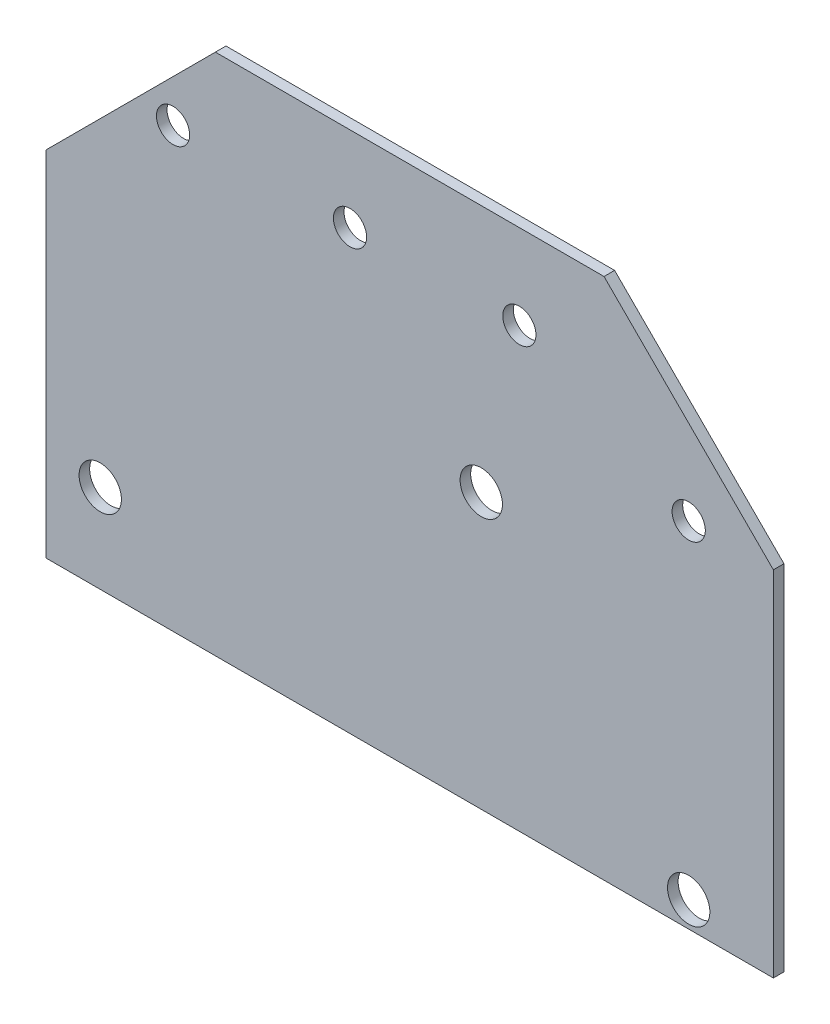
ISO-10303-21;
HEADER;
FILE_DESCRIPTION(('STEP AP214'),'2;1');
FILE_NAME('part.step','',(''),(''),'','','');
FILE_SCHEMA(('AUTOMOTIVE_DESIGN { 1 0 10303 214 1 1 1 1 }'));
ENDSEC;
DATA;
#1=APPLICATION_CONTEXT('core data for automotive mechanical design processes');
#2=APPLICATION_PROTOCOL_DEFINITION('international standard','automotive_design',2000,#1);
#3=PRODUCT_CONTEXT('',#1,'mechanical');
#4=PRODUCT('Part','Part','',(#3));
#5=PRODUCT_RELATED_PRODUCT_CATEGORY('part','',(#4));
#6=PRODUCT_DEFINITION_FORMATION('','',#4);
#7=PRODUCT_DEFINITION_CONTEXT('part definition',#1,'design');
#8=PRODUCT_DEFINITION('design','',#6,#7);
#9=PRODUCT_DEFINITION_SHAPE('','',#8);
#10=(LENGTH_UNIT() NAMED_UNIT(*) SI_UNIT(.MILLI.,.METRE.));
#11=(NAMED_UNIT(*) PLANE_ANGLE_UNIT() SI_UNIT($,.RADIAN.));
#12=(NAMED_UNIT(*) SI_UNIT($,.STERADIAN.) SOLID_ANGLE_UNIT());
#13=UNCERTAINTY_MEASURE_WITH_UNIT(LENGTH_MEASURE(1.E-05),#10,'distance_accuracy_value','');
#14=(GEOMETRIC_REPRESENTATION_CONTEXT(3) GLOBAL_UNCERTAINTY_ASSIGNED_CONTEXT((#13)) GLOBAL_UNIT_ASSIGNED_CONTEXT((#10,
#11,#12)) REPRESENTATION_CONTEXT('',''));
#15=CARTESIAN_POINT('',(0.,0.,0.));
#16=DIRECTION('',(0.,0.,1.));
#17=DIRECTION('',(1.,0.,0.));
#18=AXIS2_PLACEMENT_3D('',#15,#16,#17);
#19=CARTESIAN_POINT('',(342.900001015996,-12.7,1.5875));
#20=DIRECTION('',(-0.707106781186548,-0.707106781186547,0.));
#21=DIRECTION('',(0.707106781186547,-0.707106781186548,0.));
#22=AXIS2_PLACEMENT_3D('',#19,#20,#21);
#23=PLANE('',#22);
#24=DIRECTION('',(-0.707106781186547,0.707106781186548,0.));
#25=VECTOR('',#24,1.);
#26=CARTESIAN_POINT('',(342.900001015996,-12.7,0.));
#27=LINE('',#26,#25);
#28=CARTESIAN_POINT('',(342.900001015996,-12.7,0.));
#29=VERTEX_POINT('',#28);
#30=CARTESIAN_POINT('',(317.500001015996,12.7,0.));
#31=VERTEX_POINT('',#30);
#32=EDGE_CURVE('E121',#29,#31,#27,.T.);
#33=ORIENTED_EDGE('',*,*,#32,.T.);
#34=DIRECTION('',(0.,0.,-1.));
#35=VECTOR('',#34,1.);
#36=CARTESIAN_POINT('',(317.500001015996,12.7,1.5875));
#37=LINE('',#36,#35);
#38=CARTESIAN_POINT('',(317.500001015996,12.7,1.5875));
#39=VERTEX_POINT('',#38);
#40=EDGE_CURVE('E11',#39,#31,#37,.T.);
#41=ORIENTED_EDGE('',*,*,#40,.F.);
#42=DIRECTION('',(-0.707106781186547,0.707106781186548,0.));
#43=VECTOR('',#42,1.);
#44=CARTESIAN_POINT('',(342.900001015996,-12.7,1.5875));
#45=LINE('',#44,#43);
#46=CARTESIAN_POINT('',(342.900001015996,-12.7,1.5875));
#47=VERTEX_POINT('',#46);
#48=EDGE_CURVE('E132',#47,#39,#45,.T.);
#49=ORIENTED_EDGE('',*,*,#48,.F.);
#50=DIRECTION('',(0.,0.,-1.));
#51=VECTOR('',#50,1.);
#52=CARTESIAN_POINT('',(342.900001015996,-12.7,1.5875));
#53=LINE('',#52,#51);
#54=EDGE_CURVE('E117',#47,#29,#53,.T.);
#55=ORIENTED_EDGE('',*,*,#54,.T.);
#56=EDGE_LOOP('',(#33,#41,#49,#55));
#57=FACE_BOUND('',#56,.T.);
#58=ADVANCED_FACE('F37',(#57),#23,.F.);
#59=CARTESIAN_POINT('',(317.500001015996,12.7,1.5875));
#60=DIRECTION('',(0.,-1.,0.));
#61=DIRECTION('',(0.,0.,-1.));
#62=AXIS2_PLACEMENT_3D('',#59,#60,#61);
#63=PLANE('',#62);
#64=DIRECTION('',(-1.,0.,0.));
#65=VECTOR('',#64,1.);
#66=CARTESIAN_POINT('',(317.500001015996,12.7,0.));
#67=LINE('',#66,#65);
#68=CARTESIAN_POINT('',(259.20700050648,12.7,0.));
#69=VERTEX_POINT('',#68);
#70=EDGE_CURVE('E124',#31,#69,#67,.T.);
#71=ORIENTED_EDGE('',*,*,#70,.T.);
#72=DIRECTION('',(0.,0.,-1.));
#73=VECTOR('',#72,1.);
#74=CARTESIAN_POINT('',(259.20700050648,12.7,1.5875));
#75=LINE('',#74,#73);
#76=CARTESIAN_POINT('',(259.20700050648,12.7,1.5875));
#77=VERTEX_POINT('',#76);
#78=EDGE_CURVE('E45',#77,#69,#75,.T.);
#79=ORIENTED_EDGE('',*,*,#78,.F.);
#80=DIRECTION('',(-1.,0.,0.));
#81=VECTOR('',#80,1.);
#82=CARTESIAN_POINT('',(317.500001015996,12.7,1.5875));
#83=LINE('',#82,#81);
#84=EDGE_CURVE('E90',#39,#77,#83,.T.);
#85=ORIENTED_EDGE('',*,*,#84,.F.);
#86=ORIENTED_EDGE('',*,*,#40,.T.);
#87=EDGE_LOOP('',(#71,#79,#85,#86));
#88=FACE_BOUND('',#87,.T.);
#89=ADVANCED_FACE('F157',(#88),#63,.F.);
#90=CARTESIAN_POINT('',(259.20700050648,12.7,1.5875));
#91=DIRECTION('',(0.707106781186548,-0.707106781186547,0.));
#92=DIRECTION('',(0.707106781186547,0.707106781186548,0.));
#93=AXIS2_PLACEMENT_3D('',#90,#91,#92);
#94=PLANE('',#93);
#95=DIRECTION('',(-0.707106781186547,-0.707106781186548,0.));
#96=VECTOR('',#95,1.);
#97=CARTESIAN_POINT('',(259.20700050648,12.7,0.));
#98=LINE('',#97,#96);
#99=CARTESIAN_POINT('',(233.80700050648,-12.7,0.));
#100=VERTEX_POINT('',#99);
#101=EDGE_CURVE('E127',#69,#100,#98,.T.);
#102=ORIENTED_EDGE('',*,*,#101,.T.);
#103=DIRECTION('',(0.,0.,-1.));
#104=VECTOR('',#103,1.);
#105=CARTESIAN_POINT('',(233.80700050648,-12.7,1.5875));
#106=LINE('',#105,#104);
#107=CARTESIAN_POINT('',(233.80700050648,-12.7,1.5875));
#108=VERTEX_POINT('',#107);
#109=EDGE_CURVE('E112',#108,#100,#106,.T.);
#110=ORIENTED_EDGE('',*,*,#109,.F.);
#111=DIRECTION('',(-0.707106781186547,-0.707106781186548,0.));
#112=VECTOR('',#111,1.);
#113=CARTESIAN_POINT('',(259.20700050648,12.7,1.5875));
#114=LINE('',#113,#112);
#115=EDGE_CURVE('E103',#77,#108,#114,.T.);
#116=ORIENTED_EDGE('',*,*,#115,.F.);
#117=ORIENTED_EDGE('',*,*,#78,.T.);
#118=EDGE_LOOP('',(#102,#110,#116,#117));
#119=FACE_BOUND('',#118,.T.);
#120=ADVANCED_FACE('F138',(#119),#94,.F.);
#121=CARTESIAN_POINT('',(233.80700050648,-12.7,1.5875));
#122=DIRECTION('',(1.,0.,0.));
#123=DIRECTION('',(0.,0.,-1.));
#124=AXIS2_PLACEMENT_3D('',#121,#122,#123);
#125=PLANE('',#124);
#126=DIRECTION('',(0.,-1.,0.));
#127=VECTOR('',#126,1.);
#128=CARTESIAN_POINT('',(233.80700050648,-12.7,0.));
#129=LINE('',#128,#127);
#130=CARTESIAN_POINT('',(233.80700050648,-65.7225000001326,0.));
#131=VERTEX_POINT('',#130);
#132=EDGE_CURVE('E111',#100,#131,#129,.T.);
#133=ORIENTED_EDGE('',*,*,#132,.T.);
#134=DIRECTION('',(0.,0.,-1.));
#135=VECTOR('',#134,1.);
#136=CARTESIAN_POINT('',(233.80700050648,-65.7225000001326,1.5875));
#137=LINE('',#136,#135);
#138=CARTESIAN_POINT('',(233.80700050648,-65.7225000001326,1.5875));
#139=VERTEX_POINT('',#138);
#140=EDGE_CURVE('E108',#139,#131,#137,.T.);
#141=ORIENTED_EDGE('',*,*,#140,.F.);
#142=DIRECTION('',(0.,-1.,0.));
#143=VECTOR('',#142,1.);
#144=CARTESIAN_POINT('',(233.80700050648,-12.7,1.5875));
#145=LINE('',#144,#143);
#146=EDGE_CURVE('E97',#108,#139,#145,.T.);
#147=ORIENTED_EDGE('',*,*,#146,.F.);
#148=ORIENTED_EDGE('',*,*,#109,.T.);
#149=EDGE_LOOP('',(#133,#141,#147,#148));
#150=FACE_BOUND('',#149,.T.);
#151=ADVANCED_FACE('F109',(#150),#125,.F.);
#152=CARTESIAN_POINT('',(233.80700050648,-65.7225000001326,1.5875));
#153=DIRECTION('',(0.,1.,0.));
#154=DIRECTION('',(0.,0.,1.));
#155=AXIS2_PLACEMENT_3D('',#152,#153,#154);
#156=PLANE('',#155);
#157=DIRECTION('',(1.,0.,0.));
#158=VECTOR('',#157,1.);
#159=CARTESIAN_POINT('',(233.80700050648,-65.7225000001326,0.));
#160=LINE('',#159,#158);
#161=CARTESIAN_POINT('',(342.900001015996,-65.7225000001326,0.));
#162=VERTEX_POINT('',#161);
#163=EDGE_CURVE('E76',#131,#162,#160,.T.);
#164=ORIENTED_EDGE('',*,*,#163,.T.);
#165=DIRECTION('',(0.,0.,-1.));
#166=VECTOR('',#165,1.);
#167=CARTESIAN_POINT('',(342.900001015996,-65.7225000001326,1.5875));
#168=LINE('',#167,#166);
#169=CARTESIAN_POINT('',(342.900001015996,-65.7225000001326,1.5875));
#170=VERTEX_POINT('',#169);
#171=EDGE_CURVE('E113',#170,#162,#168,.T.);
#172=ORIENTED_EDGE('',*,*,#171,.F.);
#173=DIRECTION('',(1.,0.,0.));
#174=VECTOR('',#173,1.);
#175=CARTESIAN_POINT('',(233.80700050648,-65.7225000001326,1.5875));
#176=LINE('',#175,#174);
#177=EDGE_CURVE('E101',#139,#170,#176,.T.);
#178=ORIENTED_EDGE('',*,*,#177,.F.);
#179=ORIENTED_EDGE('',*,*,#140,.T.);
#180=EDGE_LOOP('',(#164,#172,#178,#179));
#181=FACE_BOUND('',#180,.T.);
#182=ADVANCED_FACE('F115',(#181),#156,.F.);
#183=CARTESIAN_POINT('',(342.900001015996,-65.7225000001326,1.5875));
#184=DIRECTION('',(-1.,0.,0.));
#185=DIRECTION('',(0.,0.,1.));
#186=AXIS2_PLACEMENT_3D('',#183,#184,#185);
#187=PLANE('',#186);
#188=DIRECTION('',(0.,1.,0.));
#189=VECTOR('',#188,1.);
#190=CARTESIAN_POINT('',(342.900001015996,-65.7225000001326,0.));
#191=LINE('',#190,#189);
#192=EDGE_CURVE('E82',#162,#29,#191,.T.);
#193=ORIENTED_EDGE('',*,*,#192,.T.);
#194=ORIENTED_EDGE('',*,*,#54,.F.);
#195=DIRECTION('',(0.,1.,0.));
#196=VECTOR('',#195,1.);
#197=CARTESIAN_POINT('',(342.900001015996,-65.7225000001326,1.5875));
#198=LINE('',#197,#196);
#199=EDGE_CURVE('E53',#170,#47,#198,.T.);
#200=ORIENTED_EDGE('',*,*,#199,.F.);
#201=ORIENTED_EDGE('',*,*,#171,.T.);
#202=EDGE_LOOP('',(#193,#194,#200,#201));
#203=FACE_BOUND('',#202,.T.);
#204=ADVANCED_FACE('F145',(#203),#187,.F.);
#205=CARTESIAN_POINT('',(0.,0.,1.5875));
#206=DIRECTION('',(0.,0.,1.));
#207=DIRECTION('',(1.,0.,0.));
#208=AXIS2_PLACEMENT_3D('',#205,#206,#207);
#209=PLANE('',#208);
#210=CARTESIAN_POINT('',(299.08500101593,-24.5251884521311,1.5875));
#211=DIRECTION('',(0.,0.,1.));
#212=DIRECTION('',(1.,0.,0.));
#213=AXIS2_PLACEMENT_3D('',#210,#211,#212);
#214=CIRCLE('',#213,3.17499999999998);
#215=CARTESIAN_POINT('',(302.26000101593,-24.5251884521311,1.5875));
#216=VERTEX_POINT('',#215);
#217=EDGE_CURVE('E317',#216,#216,#214,.T.);
#218=ORIENTED_EDGE('',*,*,#217,.F.);
#219=EDGE_LOOP('',(#218));
#220=FACE_BOUND('',#219,.T.);
#221=CARTESIAN_POINT('',(241.935001015939,-52.4651884521511,1.5875));
#222=DIRECTION('',(0.,0.,1.));
#223=DIRECTION('',(1.,0.,0.));
#224=AXIS2_PLACEMENT_3D('',#221,#222,#223);
#225=CIRCLE('',#224,3.17499999999998);
#226=CARTESIAN_POINT('',(245.110001015939,-52.4651884521511,1.5875));
#227=VERTEX_POINT('',#226);
#228=EDGE_CURVE('E319',#227,#227,#225,.T.);
#229=ORIENTED_EDGE('',*,*,#228,.F.);
#230=EDGE_LOOP('',(#229));
#231=FACE_BOUND('',#230,.T.);
#232=CARTESIAN_POINT('',(330.200001015876,-61.9124999998628,1.5875));
#233=DIRECTION('',(0.,0.,-1.));
#234=DIRECTION('',(-1.,0.,0.));
#235=AXIS2_PLACEMENT_3D('',#232,#233,#234);
#236=CIRCLE('',#235,3.17499999999998);
#237=CARTESIAN_POINT('',(327.025001015876,-61.9124999998628,1.5875));
#238=VERTEX_POINT('',#237);
#239=EDGE_CURVE('E330',#238,#238,#236,.T.);
#240=ORIENTED_EDGE('',*,*,#239,.T.);
#241=EDGE_LOOP('',(#240));
#242=FACE_BOUND('',#241,.T.);
#243=CARTESIAN_POINT('',(330.199999492,-12.7,1.5875));
#244=DIRECTION('',(0.,0.,-1.));
#245=DIRECTION('',(-1.,0.,0.));
#246=AXIS2_PLACEMENT_3D('',#243,#244,#245);
#247=CIRCLE('',#246,2.48919999999997);
#248=CARTESIAN_POINT('',(327.710799492,-12.7,1.5875));
#249=VERTEX_POINT('',#248);
#250=EDGE_CURVE('E336',#249,#249,#247,.T.);
#251=ORIENTED_EDGE('',*,*,#250,.T.);
#252=EDGE_LOOP('',(#251));
#253=FACE_BOUND('',#252,.T.);
#254=CARTESIAN_POINT('',(304.799999492002,-1.73472347597681E-12,1.5875));
#255=DIRECTION('',(0.,0.,-1.));
#256=DIRECTION('',(-1.,0.,0.));
#257=AXIS2_PLACEMENT_3D('',#254,#255,#256);
#258=CIRCLE('',#257,2.48919999999997);
#259=CARTESIAN_POINT('',(302.310799492002,-1.73472347597681E-12,1.5875));
#260=VERTEX_POINT('',#259);
#261=EDGE_CURVE('E342',#260,#260,#258,.T.);
#262=ORIENTED_EDGE('',*,*,#261,.T.);
#263=EDGE_LOOP('',(#262));
#264=FACE_BOUND('',#263,.T.);
#265=CARTESIAN_POINT('',(279.399999492,0.,1.5875));
#266=DIRECTION('',(0.,0.,-1.));
#267=DIRECTION('',(-1.,0.,0.));
#268=AXIS2_PLACEMENT_3D('',#265,#266,#267);
#269=CIRCLE('',#268,2.48919999999997);
#270=CARTESIAN_POINT('',(276.910799492,0.,1.5875));
#271=VERTEX_POINT('',#270);
#272=EDGE_CURVE('E348',#271,#271,#269,.T.);
#273=ORIENTED_EDGE('',*,*,#272,.T.);
#274=EDGE_LOOP('',(#273));
#275=FACE_BOUND('',#274,.T.);
#276=CARTESIAN_POINT('',(252.857001003831,-7.59112217529889E-09,1.5875));
#277=DIRECTION('',(0.,0.,-1.));
#278=DIRECTION('',(-1.,0.,0.));
#279=AXIS2_PLACEMENT_3D('',#276,#277,#278);
#280=CIRCLE('',#279,2.48919999999997);
#281=CARTESIAN_POINT('',(250.367801003831,-7.59112217529889E-09,1.5875));
#282=VERTEX_POINT('',#281);
#283=EDGE_CURVE('E125',#282,#282,#280,.T.);
#284=ORIENTED_EDGE('',*,*,#283,.T.);
#285=EDGE_LOOP('',(#284));
#286=FACE_BOUND('',#285,.T.);
#287=ORIENTED_EDGE('',*,*,#48,.T.);
#288=ORIENTED_EDGE('',*,*,#84,.T.);
#289=ORIENTED_EDGE('',*,*,#115,.T.);
#290=ORIENTED_EDGE('',*,*,#146,.T.);
#291=ORIENTED_EDGE('',*,*,#177,.T.);
#292=ORIENTED_EDGE('',*,*,#199,.T.);
#293=EDGE_LOOP('',(#287,#288,#289,#290,#291,#292));
#294=FACE_BOUND('',#293,.T.);
#295=ADVANCED_FACE('F99',(#220,#231,#242,#253,#264,#275,#286,#294),#209,.T.);
#296=CARTESIAN_POINT('',(0.,0.,0.));
#297=DIRECTION('',(0.,0.,1.));
#298=DIRECTION('',(1.,0.,0.));
#299=AXIS2_PLACEMENT_3D('',#296,#297,#298);
#300=PLANE('',#299);
#301=CARTESIAN_POINT('',(299.08500101593,-24.5251884521311,0.));
#302=DIRECTION('',(0.,0.,1.));
#303=DIRECTION('',(1.,0.,0.));
#304=AXIS2_PLACEMENT_3D('',#301,#302,#303);
#305=CIRCLE('',#304,3.17499999999998);
#306=CARTESIAN_POINT('',(302.26000101593,-24.5251884521311,0.));
#307=VERTEX_POINT('',#306);
#308=EDGE_CURVE('E314',#307,#307,#305,.T.);
#309=ORIENTED_EDGE('',*,*,#308,.T.);
#310=EDGE_LOOP('',(#309));
#311=FACE_BOUND('',#310,.T.);
#312=CARTESIAN_POINT('',(241.935001015939,-52.4651884521511,0.));
#313=DIRECTION('',(0.,0.,1.));
#314=DIRECTION('',(1.,0.,0.));
#315=AXIS2_PLACEMENT_3D('',#312,#313,#314);
#316=CIRCLE('',#315,3.17499999999998);
#317=CARTESIAN_POINT('',(245.110001015939,-52.4651884521511,0.));
#318=VERTEX_POINT('',#317);
#319=EDGE_CURVE('E324',#318,#318,#316,.T.);
#320=ORIENTED_EDGE('',*,*,#319,.T.);
#321=EDGE_LOOP('',(#320));
#322=FACE_BOUND('',#321,.T.);
#323=CARTESIAN_POINT('',(330.200001015876,-61.9124999998628,0.));
#324=DIRECTION('',(0.,0.,-1.));
#325=DIRECTION('',(-1.,0.,0.));
#326=AXIS2_PLACEMENT_3D('',#323,#324,#325);
#327=CIRCLE('',#326,3.17499999999998);
#328=CARTESIAN_POINT('',(327.025001015876,-61.9124999998628,0.));
#329=VERTEX_POINT('',#328);
#330=EDGE_CURVE('E327',#329,#329,#327,.T.);
#331=ORIENTED_EDGE('',*,*,#330,.F.);
#332=EDGE_LOOP('',(#331));
#333=FACE_BOUND('',#332,.T.);
#334=CARTESIAN_POINT('',(330.199999492,-12.7,0.));
#335=DIRECTION('',(0.,0.,-1.));
#336=DIRECTION('',(-1.,0.,0.));
#337=AXIS2_PLACEMENT_3D('',#334,#335,#336);
#338=CIRCLE('',#337,2.48920000000002);
#339=CARTESIAN_POINT('',(327.710799492,-12.7,0.));
#340=VERTEX_POINT('',#339);
#341=EDGE_CURVE('E333',#340,#340,#338,.T.);
#342=ORIENTED_EDGE('',*,*,#341,.F.);
#343=EDGE_LOOP('',(#342));
#344=FACE_BOUND('',#343,.T.);
#345=CARTESIAN_POINT('',(304.799999492002,-1.73472347597681E-12,0.));
#346=DIRECTION('',(0.,0.,-1.));
#347=DIRECTION('',(-1.,0.,0.));
#348=AXIS2_PLACEMENT_3D('',#345,#346,#347);
#349=CIRCLE('',#348,2.48920000000002);
#350=CARTESIAN_POINT('',(302.310799492002,-1.73472347597681E-12,0.));
#351=VERTEX_POINT('',#350);
#352=EDGE_CURVE('E339',#351,#351,#349,.T.);
#353=ORIENTED_EDGE('',*,*,#352,.F.);
#354=EDGE_LOOP('',(#353));
#355=FACE_BOUND('',#354,.T.);
#356=CARTESIAN_POINT('',(279.399999492,0.,0.));
#357=DIRECTION('',(0.,0.,-1.));
#358=DIRECTION('',(-1.,0.,0.));
#359=AXIS2_PLACEMENT_3D('',#356,#357,#358);
#360=CIRCLE('',#359,2.48920000000002);
#361=CARTESIAN_POINT('',(276.910799492,0.,0.));
#362=VERTEX_POINT('',#361);
#363=EDGE_CURVE('E345',#362,#362,#360,.T.);
#364=ORIENTED_EDGE('',*,*,#363,.F.);
#365=EDGE_LOOP('',(#364));
#366=FACE_BOUND('',#365,.T.);
#367=CARTESIAN_POINT('',(252.857001003831,-7.59112217529889E-09,0.));
#368=DIRECTION('',(0.,0.,-1.));
#369=DIRECTION('',(-1.,0.,0.));
#370=AXIS2_PLACEMENT_3D('',#367,#368,#369);
#371=CIRCLE('',#370,2.48920000000002);
#372=CARTESIAN_POINT('',(250.367801003831,-7.59112217529889E-09,0.));
#373=VERTEX_POINT('',#372);
#374=EDGE_CURVE('E351',#373,#373,#371,.T.);
#375=ORIENTED_EDGE('',*,*,#374,.F.);
#376=EDGE_LOOP('',(#375));
#377=FACE_BOUND('',#376,.T.);
#378=ORIENTED_EDGE('',*,*,#32,.F.);
#379=ORIENTED_EDGE('',*,*,#192,.F.);
#380=ORIENTED_EDGE('',*,*,#163,.F.);
#381=ORIENTED_EDGE('',*,*,#132,.F.);
#382=ORIENTED_EDGE('',*,*,#101,.F.);
#383=ORIENTED_EDGE('',*,*,#70,.F.);
#384=EDGE_LOOP('',(#378,#379,#380,#381,#382,#383));
#385=FACE_BOUND('',#384,.T.);
#386=ADVANCED_FACE('F141',(#311,#322,#333,#344,#355,#366,#377,#385),#300,.F.);
#387=CARTESIAN_POINT('',(252.857001003831,-7.59112217529889E-09,0.));
#388=DIRECTION('',(0.,0.,-1.));
#389=DIRECTION('',(-1.,0.,0.));
#390=AXIS2_PLACEMENT_3D('',#387,#388,#389);
#391=CYLINDRICAL_SURFACE('',#390,2.4892);
#392=ORIENTED_EDGE('',*,*,#283,.F.);
#393=EDGE_LOOP('',(#392));
#394=FACE_BOUND('',#393,.T.);
#395=ORIENTED_EDGE('',*,*,#374,.T.);
#396=EDGE_LOOP('',(#395));
#397=FACE_BOUND('',#396,.T.);
#398=ADVANCED_FACE('F187',(#394,#397),#391,.F.);
#399=CARTESIAN_POINT('',(279.399999492,0.,0.));
#400=DIRECTION('',(0.,0.,-1.));
#401=DIRECTION('',(-1.,0.,0.));
#402=AXIS2_PLACEMENT_3D('',#399,#400,#401);
#403=CYLINDRICAL_SURFACE('',#402,2.4892);
#404=ORIENTED_EDGE('',*,*,#272,.F.);
#405=EDGE_LOOP('',(#404));
#406=FACE_BOUND('',#405,.T.);
#407=ORIENTED_EDGE('',*,*,#363,.T.);
#408=EDGE_LOOP('',(#407));
#409=FACE_BOUND('',#408,.T.);
#410=ADVANCED_FACE('F192',(#406,#409),#403,.F.);
#411=CARTESIAN_POINT('',(304.799999492002,-1.73472347597681E-12,0.));
#412=DIRECTION('',(0.,0.,-1.));
#413=DIRECTION('',(-1.,0.,0.));
#414=AXIS2_PLACEMENT_3D('',#411,#412,#413);
#415=CYLINDRICAL_SURFACE('',#414,2.4892);
#416=ORIENTED_EDGE('',*,*,#261,.F.);
#417=EDGE_LOOP('',(#416));
#418=FACE_BOUND('',#417,.T.);
#419=ORIENTED_EDGE('',*,*,#352,.T.);
#420=EDGE_LOOP('',(#419));
#421=FACE_BOUND('',#420,.T.);
#422=ADVANCED_FACE('F205',(#418,#421),#415,.F.);
#423=CARTESIAN_POINT('',(330.199999492,-12.7,0.));
#424=DIRECTION('',(0.,0.,-1.));
#425=DIRECTION('',(-1.,0.,0.));
#426=AXIS2_PLACEMENT_3D('',#423,#424,#425);
#427=CYLINDRICAL_SURFACE('',#426,2.4892);
#428=ORIENTED_EDGE('',*,*,#250,.F.);
#429=EDGE_LOOP('',(#428));
#430=FACE_BOUND('',#429,.T.);
#431=ORIENTED_EDGE('',*,*,#341,.T.);
#432=EDGE_LOOP('',(#431));
#433=FACE_BOUND('',#432,.T.);
#434=ADVANCED_FACE('F216',(#430,#433),#427,.F.);
#435=CARTESIAN_POINT('',(330.200001015876,-61.9124999998628,0.));
#436=DIRECTION('',(0.,0.,-1.));
#437=DIRECTION('',(-1.,0.,0.));
#438=AXIS2_PLACEMENT_3D('',#435,#436,#437);
#439=CYLINDRICAL_SURFACE('',#438,3.17499999999998);
#440=ORIENTED_EDGE('',*,*,#239,.F.);
#441=EDGE_LOOP('',(#440));
#442=FACE_BOUND('',#441,.T.);
#443=ORIENTED_EDGE('',*,*,#330,.T.);
#444=EDGE_LOOP('',(#443));
#445=FACE_BOUND('',#444,.T.);
#446=ADVANCED_FACE('F227',(#442,#445),#439,.F.);
#447=CARTESIAN_POINT('',(241.935001015939,-52.4651884521511,1.5875));
#448=DIRECTION('',(0.,0.,1.));
#449=DIRECTION('',(1.,0.,0.));
#450=AXIS2_PLACEMENT_3D('',#447,#448,#449);
#451=CYLINDRICAL_SURFACE('',#450,3.17499999999998);
#452=ORIENTED_EDGE('',*,*,#319,.F.);
#453=EDGE_LOOP('',(#452));
#454=FACE_BOUND('',#453,.T.);
#455=ORIENTED_EDGE('',*,*,#228,.T.);
#456=EDGE_LOOP('',(#455));
#457=FACE_BOUND('',#456,.T.);
#458=ADVANCED_FACE('F238',(#454,#457),#451,.F.);
#459=CARTESIAN_POINT('',(299.08500101593,-24.5251884521311,1.5875));
#460=DIRECTION('',(0.,0.,1.));
#461=DIRECTION('',(1.,0.,0.));
#462=AXIS2_PLACEMENT_3D('',#459,#460,#461);
#463=CYLINDRICAL_SURFACE('',#462,3.17499999999998);
#464=ORIENTED_EDGE('',*,*,#308,.F.);
#465=EDGE_LOOP('',(#464));
#466=FACE_BOUND('',#465,.T.);
#467=ORIENTED_EDGE('',*,*,#217,.T.);
#468=EDGE_LOOP('',(#467));
#469=FACE_BOUND('',#468,.T.);
#470=ADVANCED_FACE('F262',(#466,#469),#463,.F.);
#471=CLOSED_SHELL('',(#58,#89,#120,#151,#182,#204,#295,#386,#398,#410,#422,#434,#446,#458,#470));
#472=MANIFOLD_SOLID_BREP('B2',#471);
#473=ADVANCED_BREP_SHAPE_REPRESENTATION('',(#18,#472),#14);
#474=SHAPE_DEFINITION_REPRESENTATION(#9,#473);
ENDSEC;
END-ISO-10303-21;
